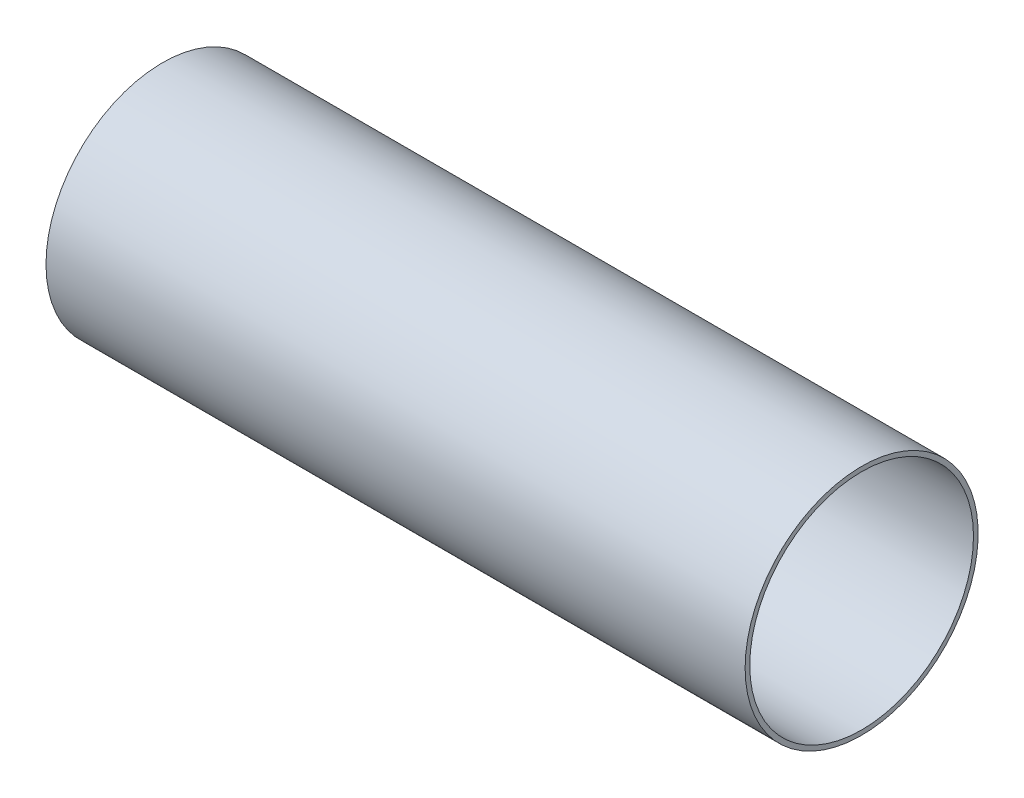
ISO-10303-21;
HEADER;
FILE_DESCRIPTION(('STEP AP214'),'2;1');
FILE_NAME('part.step','',(''),(''),'','','');
FILE_SCHEMA(('AUTOMOTIVE_DESIGN { 1 0 10303 214 1 1 1 1 }'));
ENDSEC;
DATA;
#1=APPLICATION_CONTEXT('core data for automotive mechanical design processes');
#2=APPLICATION_PROTOCOL_DEFINITION('international standard','automotive_design',2000,#1);
#3=PRODUCT_CONTEXT('',#1,'mechanical');
#4=PRODUCT('Part','Part','',(#3));
#5=PRODUCT_RELATED_PRODUCT_CATEGORY('part','',(#4));
#6=PRODUCT_DEFINITION_FORMATION('','',#4);
#7=PRODUCT_DEFINITION_CONTEXT('part definition',#1,'design');
#8=PRODUCT_DEFINITION('design','',#6,#7);
#9=PRODUCT_DEFINITION_SHAPE('','',#8);
#10=(LENGTH_UNIT() NAMED_UNIT(*) SI_UNIT(.MILLI.,.METRE.));
#11=(NAMED_UNIT(*) PLANE_ANGLE_UNIT() SI_UNIT($,.RADIAN.));
#12=(NAMED_UNIT(*) SI_UNIT($,.STERADIAN.) SOLID_ANGLE_UNIT());
#13=UNCERTAINTY_MEASURE_WITH_UNIT(LENGTH_MEASURE(1.E-05),#10,'distance_accuracy_value','');
#14=(GEOMETRIC_REPRESENTATION_CONTEXT(3) GLOBAL_UNCERTAINTY_ASSIGNED_CONTEXT((#13)) GLOBAL_UNIT_ASSIGNED_CONTEXT((#10,
#11,#12)) REPRESENTATION_CONTEXT('',''));
#15=CARTESIAN_POINT('',(0.,0.,0.));
#16=DIRECTION('',(0.,0.,1.));
#17=DIRECTION('',(1.,0.,0.));
#18=AXIS2_PLACEMENT_3D('',#15,#16,#17);
#19=CARTESIAN_POINT('',(-150.,50.,0.));
#20=DIRECTION('',(1.,0.,0.));
#21=DIRECTION('',(0.,0.,-1.));
#22=AXIS2_PLACEMENT_3D('',#19,#20,#21);
#23=PLANE('',#22);
#24=CARTESIAN_POINT('',(-150.,0.,0.));
#25=DIRECTION('',(-1.,0.,0.));
#26=DIRECTION('',(0.,0.,1.));
#27=AXIS2_PLACEMENT_3D('',#24,#25,#26);
#28=CIRCLE('',#27,48.);
#29=CARTESIAN_POINT('',(-150.,0.,48.));
#30=VERTEX_POINT('',#29);
#31=EDGE_CURVE('E10',#30,#30,#28,.T.);
#32=ORIENTED_EDGE('',*,*,#31,.F.);
#33=EDGE_LOOP('',(#32));
#34=FACE_BOUND('',#33,.T.);
#35=CARTESIAN_POINT('',(-150.,0.,0.));
#36=DIRECTION('',(-1.,0.,0.));
#37=DIRECTION('',(0.,0.,1.));
#38=AXIS2_PLACEMENT_3D('',#35,#36,#37);
#39=CIRCLE('',#38,50.);
#40=CARTESIAN_POINT('',(-150.,0.,50.));
#41=VERTEX_POINT('',#40);
#42=EDGE_CURVE('E47',#41,#41,#39,.T.);
#43=ORIENTED_EDGE('',*,*,#42,.T.);
#44=EDGE_LOOP('',(#43));
#45=FACE_BOUND('',#44,.T.);
#46=ADVANCED_FACE('F33',(#34,#45),#23,.F.);
#47=CARTESIAN_POINT('',(-21.8904817142857,0.,0.));
#48=DIRECTION('',(-1.,0.,0.));
#49=DIRECTION('',(0.,0.,1.));
#50=AXIS2_PLACEMENT_3D('',#47,#48,#49);
#51=CYLINDRICAL_SURFACE('',#50,48.);
#52=CARTESIAN_POINT('',(150.,0.,0.));
#53=DIRECTION('',(-1.,0.,0.));
#54=DIRECTION('',(0.,0.,1.));
#55=AXIS2_PLACEMENT_3D('',#52,#53,#54);
#56=CIRCLE('',#55,48.);
#57=CARTESIAN_POINT('',(150.,0.,48.));
#58=VERTEX_POINT('',#57);
#59=EDGE_CURVE('E39',#58,#58,#56,.T.);
#60=ORIENTED_EDGE('',*,*,#59,.F.);
#61=EDGE_LOOP('',(#60));
#62=FACE_BOUND('',#61,.T.);
#63=ORIENTED_EDGE('',*,*,#31,.T.);
#64=EDGE_LOOP('',(#63));
#65=FACE_BOUND('',#64,.T.);
#66=ADVANCED_FACE('F62',(#62,#65),#51,.F.);
#67=CARTESIAN_POINT('',(150.,50.,0.));
#68=DIRECTION('',(-1.,0.,0.));
#69=DIRECTION('',(0.,0.,1.));
#70=AXIS2_PLACEMENT_3D('',#67,#68,#69);
#71=PLANE('',#70);
#72=CARTESIAN_POINT('',(150.,0.,0.));
#73=DIRECTION('',(-1.,0.,0.));
#74=DIRECTION('',(0.,0.,1.));
#75=AXIS2_PLACEMENT_3D('',#72,#73,#74);
#76=CIRCLE('',#75,50.);
#77=CARTESIAN_POINT('',(150.,0.,50.));
#78=VERTEX_POINT('',#77);
#79=EDGE_CURVE('E43',#78,#78,#76,.T.);
#80=ORIENTED_EDGE('',*,*,#79,.F.);
#81=EDGE_LOOP('',(#80));
#82=FACE_BOUND('',#81,.T.);
#83=ORIENTED_EDGE('',*,*,#59,.T.);
#84=EDGE_LOOP('',(#83));
#85=FACE_BOUND('',#84,.T.);
#86=ADVANCED_FACE('F57',(#82,#85),#71,.F.);
#87=CARTESIAN_POINT('',(-21.8904817142857,0.,0.));
#88=DIRECTION('',(-1.,0.,0.));
#89=DIRECTION('',(0.,0.,1.));
#90=AXIS2_PLACEMENT_3D('',#87,#88,#89);
#91=CYLINDRICAL_SURFACE('',#90,50.);
#92=ORIENTED_EDGE('',*,*,#42,.F.);
#93=EDGE_LOOP('',(#92));
#94=FACE_BOUND('',#93,.T.);
#95=ORIENTED_EDGE('',*,*,#79,.T.);
#96=EDGE_LOOP('',(#95));
#97=FACE_BOUND('',#96,.T.);
#98=ADVANCED_FACE('F54',(#94,#97),#91,.T.);
#99=CLOSED_SHELL('',(#46,#66,#86,#98));
#100=MANIFOLD_SOLID_BREP('B2',#99);
#101=ADVANCED_BREP_SHAPE_REPRESENTATION('',(#18,#100),#14);
#102=SHAPE_DEFINITION_REPRESENTATION(#9,#101);
ENDSEC;
END-ISO-10303-21;
